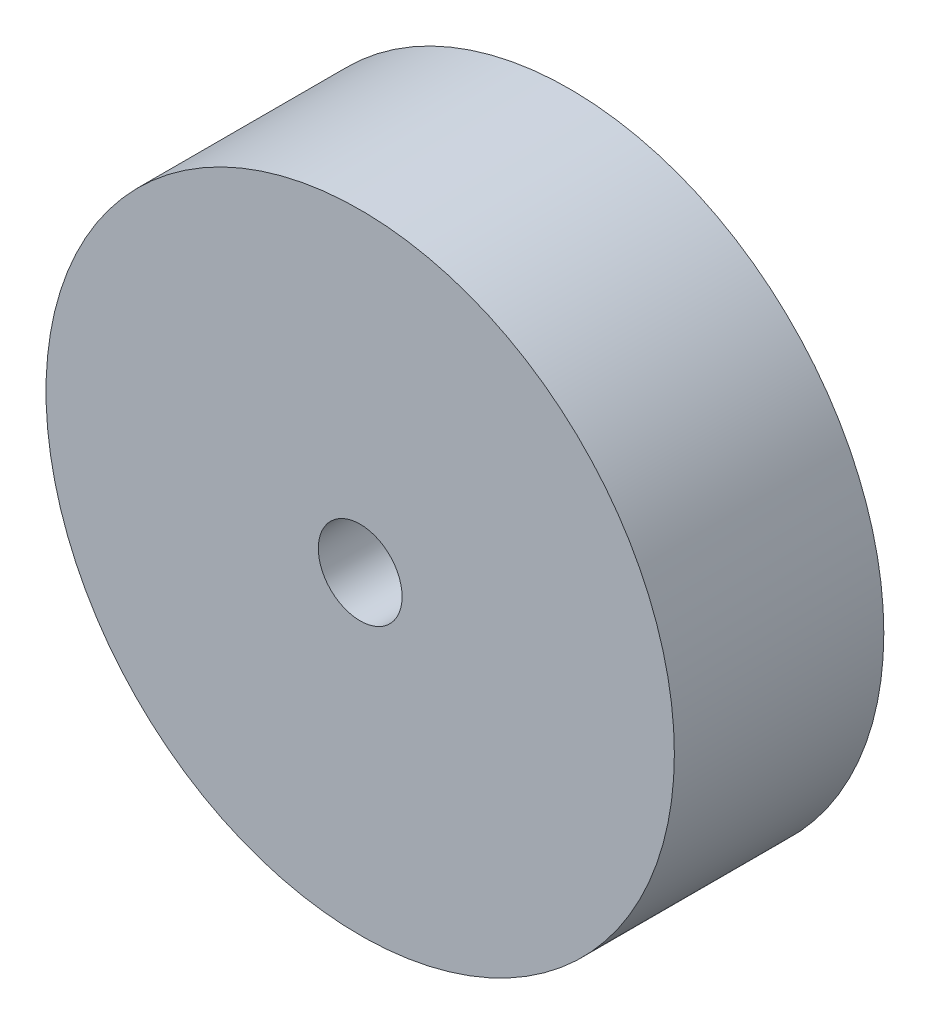
ISO-10303-21;
HEADER;
FILE_DESCRIPTION(('STEP AP214'),'2;1');
FILE_NAME('part.step','',(''),(''),'','','');
FILE_SCHEMA(('AUTOMOTIVE_DESIGN { 1 0 10303 214 1 1 1 1 }'));
ENDSEC;
DATA;
#1=APPLICATION_CONTEXT('core data for automotive mechanical design processes');
#2=APPLICATION_PROTOCOL_DEFINITION('international standard','automotive_design',2000,#1);
#3=PRODUCT_CONTEXT('',#1,'mechanical');
#4=PRODUCT('Part','Part','',(#3));
#5=PRODUCT_RELATED_PRODUCT_CATEGORY('part','',(#4));
#6=PRODUCT_DEFINITION_FORMATION('','',#4);
#7=PRODUCT_DEFINITION_CONTEXT('part definition',#1,'design');
#8=PRODUCT_DEFINITION('design','',#6,#7);
#9=PRODUCT_DEFINITION_SHAPE('','',#8);
#10=(LENGTH_UNIT() NAMED_UNIT(*) SI_UNIT(.MILLI.,.METRE.));
#11=(NAMED_UNIT(*) PLANE_ANGLE_UNIT() SI_UNIT($,.RADIAN.));
#12=(NAMED_UNIT(*) SI_UNIT($,.STERADIAN.) SOLID_ANGLE_UNIT());
#13=UNCERTAINTY_MEASURE_WITH_UNIT(LENGTH_MEASURE(1.E-05),#10,'distance_accuracy_value','');
#14=(GEOMETRIC_REPRESENTATION_CONTEXT(3) GLOBAL_UNCERTAINTY_ASSIGNED_CONTEXT((#13)) GLOBAL_UNIT_ASSIGNED_CONTEXT((#10,
#11,#12)) REPRESENTATION_CONTEXT('',''));
#15=CARTESIAN_POINT('',(0.,0.,0.));
#16=DIRECTION('',(0.,0.,1.));
#17=DIRECTION('',(1.,0.,0.));
#18=AXIS2_PLACEMENT_3D('',#15,#16,#17);
#19=CARTESIAN_POINT('',(0.,0.,10.));
#20=DIRECTION('',(0.,0.,1.));
#21=DIRECTION('',(1.,0.,0.));
#22=AXIS2_PLACEMENT_3D('',#19,#20,#21);
#23=PLANE('',#22);
#24=CARTESIAN_POINT('',(0.,0.,10.));
#25=DIRECTION('',(0.,0.,1.));
#26=DIRECTION('',(1.,0.,0.));
#27=AXIS2_PLACEMENT_3D('',#24,#25,#26);
#28=CIRCLE('',#27,15.);
#29=CARTESIAN_POINT('',(15.,0.,10.));
#30=VERTEX_POINT('',#29);
#31=EDGE_CURVE('E10',#30,#30,#28,.T.);
#32=ORIENTED_EDGE('',*,*,#31,.T.);
#33=EDGE_LOOP('',(#32));
#34=FACE_BOUND('',#33,.T.);
#35=CARTESIAN_POINT('',(0.,0.,10.));
#36=DIRECTION('',(0.,0.,1.));
#37=DIRECTION('',(1.,0.,0.));
#38=AXIS2_PLACEMENT_3D('',#35,#36,#37);
#39=CIRCLE('',#38,2.);
#40=CARTESIAN_POINT('',(2.,0.,10.));
#41=VERTEX_POINT('',#40);
#42=EDGE_CURVE('E50',#41,#41,#39,.T.);
#43=ORIENTED_EDGE('',*,*,#42,.F.);
#44=EDGE_LOOP('',(#43));
#45=FACE_BOUND('',#44,.T.);
#46=ADVANCED_FACE('F37',(#34,#45),#23,.T.);
#47=CARTESIAN_POINT('',(0.,0.,0.));
#48=DIRECTION('',(0.,0.,1.));
#49=DIRECTION('',(1.,0.,0.));
#50=AXIS2_PLACEMENT_3D('',#47,#48,#49);
#51=PLANE('',#50);
#52=CARTESIAN_POINT('',(0.,0.,0.));
#53=DIRECTION('',(0.,0.,1.));
#54=DIRECTION('',(1.,0.,0.));
#55=AXIS2_PLACEMENT_3D('',#52,#53,#54);
#56=CIRCLE('',#55,15.);
#57=CARTESIAN_POINT('',(15.,0.,0.));
#58=VERTEX_POINT('',#57);
#59=EDGE_CURVE('E41',#58,#58,#56,.T.);
#60=ORIENTED_EDGE('',*,*,#59,.F.);
#61=EDGE_LOOP('',(#60));
#62=FACE_BOUND('',#61,.T.);
#63=CARTESIAN_POINT('',(0.,0.,0.));
#64=DIRECTION('',(0.,0.,1.));
#65=DIRECTION('',(1.,0.,0.));
#66=AXIS2_PLACEMENT_3D('',#63,#64,#65);
#67=CIRCLE('',#66,2.);
#68=CARTESIAN_POINT('',(2.,0.,0.));
#69=VERTEX_POINT('',#68);
#70=EDGE_CURVE('E52',#69,#69,#67,.T.);
#71=ORIENTED_EDGE('',*,*,#70,.T.);
#72=EDGE_LOOP('',(#71));
#73=FACE_BOUND('',#72,.T.);
#74=ADVANCED_FACE('F64',(#62,#73),#51,.F.);
#75=CARTESIAN_POINT('',(0.,0.,10.));
#76=DIRECTION('',(0.,0.,-1.));
#77=DIRECTION('',(-1.,0.,0.));
#78=AXIS2_PLACEMENT_3D('',#75,#76,#77);
#79=CYLINDRICAL_SURFACE('',#78,15.);
#80=ORIENTED_EDGE('',*,*,#31,.F.);
#81=EDGE_LOOP('',(#80));
#82=FACE_BOUND('',#81,.T.);
#83=ORIENTED_EDGE('',*,*,#59,.T.);
#84=EDGE_LOOP('',(#83));
#85=FACE_BOUND('',#84,.T.);
#86=ADVANCED_FACE('F39',(#82,#85),#79,.T.);
#87=CARTESIAN_POINT('',(0.,0.,10.));
#88=DIRECTION('',(0.,0.,-1.));
#89=DIRECTION('',(-1.,0.,0.));
#90=AXIS2_PLACEMENT_3D('',#87,#88,#89);
#91=CYLINDRICAL_SURFACE('',#90,2.);
#92=ORIENTED_EDGE('',*,*,#42,.T.);
#93=EDGE_LOOP('',(#92));
#94=FACE_BOUND('',#93,.T.);
#95=ORIENTED_EDGE('',*,*,#70,.F.);
#96=EDGE_LOOP('',(#95));
#97=FACE_BOUND('',#96,.T.);
#98=ADVANCED_FACE('F60',(#94,#97),#91,.F.);
#99=CLOSED_SHELL('',(#46,#74,#86,#98));
#100=MANIFOLD_SOLID_BREP('B2',#99);
#101=ADVANCED_BREP_SHAPE_REPRESENTATION('',(#18,#100),#14);
#102=SHAPE_DEFINITION_REPRESENTATION(#9,#101);
ENDSEC;
END-ISO-10303-21;
